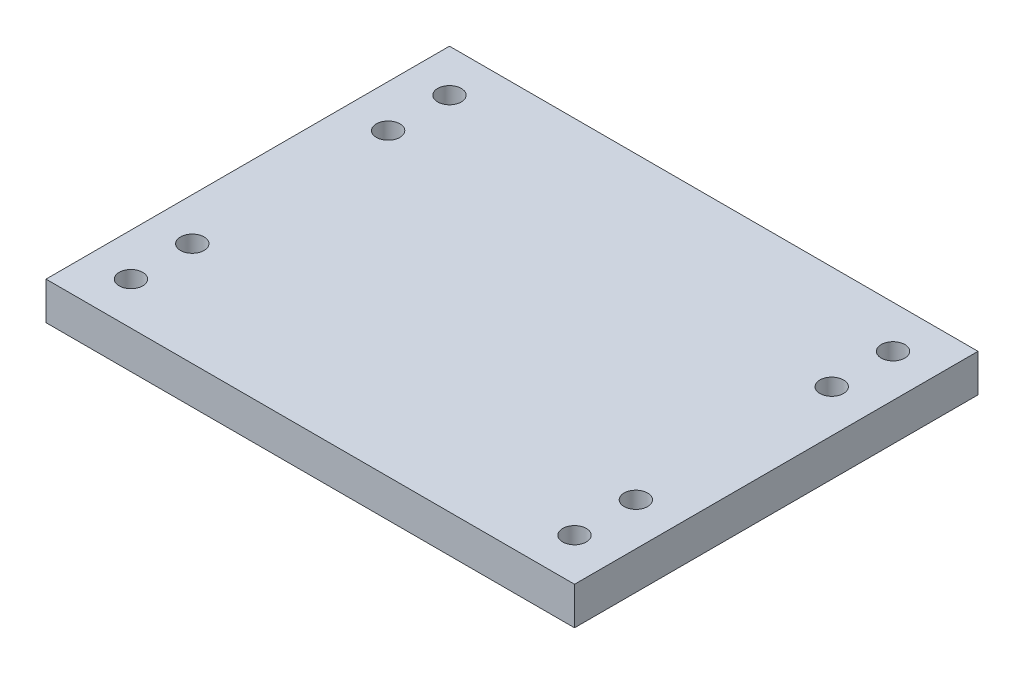
ISO-10303-21;
HEADER;
FILE_DESCRIPTION(('STEP AP214'),'2;1');
FILE_NAME('part.step','',(''),(''),'','','');
FILE_SCHEMA(('AUTOMOTIVE_DESIGN { 1 0 10303 214 1 1 1 1 }'));
ENDSEC;
DATA;
#1=APPLICATION_CONTEXT('core data for automotive mechanical design processes');
#2=APPLICATION_PROTOCOL_DEFINITION('international standard','automotive_design',2000,#1);
#3=PRODUCT_CONTEXT('',#1,'mechanical');
#4=PRODUCT('Part','Part','',(#3));
#5=PRODUCT_RELATED_PRODUCT_CATEGORY('part','',(#4));
#6=PRODUCT_DEFINITION_FORMATION('','',#4);
#7=PRODUCT_DEFINITION_CONTEXT('part definition',#1,'design');
#8=PRODUCT_DEFINITION('design','',#6,#7);
#9=PRODUCT_DEFINITION_SHAPE('','',#8);
#10=(LENGTH_UNIT() NAMED_UNIT(*) SI_UNIT(.MILLI.,.METRE.));
#11=(NAMED_UNIT(*) PLANE_ANGLE_UNIT() SI_UNIT($,.RADIAN.));
#12=(NAMED_UNIT(*) SI_UNIT($,.STERADIAN.) SOLID_ANGLE_UNIT());
#13=UNCERTAINTY_MEASURE_WITH_UNIT(LENGTH_MEASURE(1.E-05),#10,'distance_accuracy_value','');
#14=(GEOMETRIC_REPRESENTATION_CONTEXT(3) GLOBAL_UNCERTAINTY_ASSIGNED_CONTEXT((#13)) GLOBAL_UNIT_ASSIGNED_CONTEXT((#10,
#11,#12)) REPRESENTATION_CONTEXT('',''));
#15=CARTESIAN_POINT('',(0.,0.,0.));
#16=DIRECTION('',(0.,0.,1.));
#17=DIRECTION('',(1.,0.,0.));
#18=AXIS2_PLACEMENT_3D('',#15,#16,#17);
#19=CARTESIAN_POINT('',(11.2,1.6,-8.55));
#20=DIRECTION('',(-1.,0.,0.));
#21=DIRECTION('',(0.,0.,1.));
#22=AXIS2_PLACEMENT_3D('',#19,#20,#21);
#23=PLANE('',#22);
#24=DIRECTION('',(0.,0.,-1.));
#25=VECTOR('',#24,1.);
#26=CARTESIAN_POINT('',(11.2,0.,-8.55));
#27=LINE('',#26,#25);
#28=CARTESIAN_POINT('',(11.2,0.,8.55));
#29=VERTEX_POINT('',#28);
#30=CARTESIAN_POINT('',(11.2,0.,-8.55));
#31=VERTEX_POINT('',#30);
#32=EDGE_CURVE('E95',#29,#31,#27,.T.);
#33=ORIENTED_EDGE('',*,*,#32,.T.);
#34=DIRECTION('',(0.,-1.,0.));
#35=VECTOR('',#34,1.);
#36=CARTESIAN_POINT('',(11.2,1.6,-8.55));
#37=LINE('',#36,#35);
#38=CARTESIAN_POINT('',(11.2,1.6,-8.55));
#39=VERTEX_POINT('',#38);
#40=EDGE_CURVE('E11',#39,#31,#37,.T.);
#41=ORIENTED_EDGE('',*,*,#40,.F.);
#42=DIRECTION('',(0.,0.,-1.));
#43=VECTOR('',#42,1.);
#44=CARTESIAN_POINT('',(11.2,1.6,-8.55));
#45=LINE('',#44,#43);
#46=CARTESIAN_POINT('',(11.2,1.6,8.55));
#47=VERTEX_POINT('',#46);
#48=EDGE_CURVE('E83',#47,#39,#45,.T.);
#49=ORIENTED_EDGE('',*,*,#48,.F.);
#50=DIRECTION('',(0.,-1.,0.));
#51=VECTOR('',#50,1.);
#52=CARTESIAN_POINT('',(11.2,1.6,8.55));
#53=LINE('',#52,#51);
#54=EDGE_CURVE('E91',#47,#29,#53,.T.);
#55=ORIENTED_EDGE('',*,*,#54,.T.);
#56=EDGE_LOOP('',(#33,#41,#49,#55));
#57=FACE_BOUND('',#56,.T.);
#58=ADVANCED_FACE('F32',(#57),#23,.F.);
#59=CARTESIAN_POINT('',(-11.2,1.6,-8.55));
#60=DIRECTION('',(0.,0.,1.));
#61=DIRECTION('',(1.,0.,0.));
#62=AXIS2_PLACEMENT_3D('',#59,#60,#61);
#63=PLANE('',#62);
#64=DIRECTION('',(-1.,0.,0.));
#65=VECTOR('',#64,1.);
#66=CARTESIAN_POINT('',(-11.2,0.,-8.55));
#67=LINE('',#66,#65);
#68=CARTESIAN_POINT('',(-11.2,0.,-8.55));
#69=VERTEX_POINT('',#68);
#70=EDGE_CURVE('E87',#31,#69,#67,.T.);
#71=ORIENTED_EDGE('',*,*,#70,.T.);
#72=DIRECTION('',(0.,-1.,0.));
#73=VECTOR('',#72,1.);
#74=CARTESIAN_POINT('',(-11.2,1.6,-8.55));
#75=LINE('',#74,#73);
#76=CARTESIAN_POINT('',(-11.2,1.6,-8.55));
#77=VERTEX_POINT('',#76);
#78=EDGE_CURVE('E40',#77,#69,#75,.T.);
#79=ORIENTED_EDGE('',*,*,#78,.F.);
#80=DIRECTION('',(-1.,0.,0.));
#81=VECTOR('',#80,1.);
#82=CARTESIAN_POINT('',(-11.2,1.6,-8.55));
#83=LINE('',#82,#81);
#84=EDGE_CURVE('E78',#39,#77,#83,.T.);
#85=ORIENTED_EDGE('',*,*,#84,.F.);
#86=ORIENTED_EDGE('',*,*,#40,.T.);
#87=EDGE_LOOP('',(#71,#79,#85,#86));
#88=FACE_BOUND('',#87,.T.);
#89=ADVANCED_FACE('F86',(#88),#63,.F.);
#90=CARTESIAN_POINT('',(-11.2,1.6,-8.55));
#91=DIRECTION('',(1.,0.,0.));
#92=DIRECTION('',(0.,0.,-1.));
#93=AXIS2_PLACEMENT_3D('',#90,#91,#92);
#94=PLANE('',#93);
#95=DIRECTION('',(0.,0.,1.));
#96=VECTOR('',#95,1.);
#97=CARTESIAN_POINT('',(-11.2,0.,-8.55));
#98=LINE('',#97,#96);
#99=CARTESIAN_POINT('',(-11.2,0.,8.55));
#100=VERTEX_POINT('',#99);
#101=EDGE_CURVE('E65',#69,#100,#98,.T.);
#102=ORIENTED_EDGE('',*,*,#101,.T.);
#103=DIRECTION('',(0.,-1.,0.));
#104=VECTOR('',#103,1.);
#105=CARTESIAN_POINT('',(-11.2,1.6,8.55));
#106=LINE('',#105,#104);
#107=CARTESIAN_POINT('',(-11.2,1.6,8.55));
#108=VERTEX_POINT('',#107);
#109=EDGE_CURVE('E88',#108,#100,#106,.T.);
#110=ORIENTED_EDGE('',*,*,#109,.F.);
#111=DIRECTION('',(0.,0.,1.));
#112=VECTOR('',#111,1.);
#113=CARTESIAN_POINT('',(-11.2,1.6,-8.55));
#114=LINE('',#113,#112);
#115=EDGE_CURVE('E81',#77,#108,#114,.T.);
#116=ORIENTED_EDGE('',*,*,#115,.F.);
#117=ORIENTED_EDGE('',*,*,#78,.T.);
#118=EDGE_LOOP('',(#102,#110,#116,#117));
#119=FACE_BOUND('',#118,.T.);
#120=ADVANCED_FACE('F89',(#119),#94,.F.);
#121=CARTESIAN_POINT('',(-11.2,1.6,8.55));
#122=DIRECTION('',(0.,0.,-1.));
#123=DIRECTION('',(-1.,0.,0.));
#124=AXIS2_PLACEMENT_3D('',#121,#122,#123);
#125=PLANE('',#124);
#126=DIRECTION('',(1.,0.,0.));
#127=VECTOR('',#126,1.);
#128=CARTESIAN_POINT('',(-11.2,0.,8.55));
#129=LINE('',#128,#127);
#130=EDGE_CURVE('E71',#100,#29,#129,.T.);
#131=ORIENTED_EDGE('',*,*,#130,.T.);
#132=ORIENTED_EDGE('',*,*,#54,.F.);
#133=DIRECTION('',(1.,0.,0.));
#134=VECTOR('',#133,1.);
#135=CARTESIAN_POINT('',(-11.2,1.6,8.55));
#136=LINE('',#135,#134);
#137=EDGE_CURVE('E48',#108,#47,#136,.T.);
#138=ORIENTED_EDGE('',*,*,#137,.F.);
#139=ORIENTED_EDGE('',*,*,#109,.T.);
#140=EDGE_LOOP('',(#131,#132,#138,#139));
#141=FACE_BOUND('',#140,.T.);
#142=ADVANCED_FACE('F103',(#141),#125,.F.);
#143=CARTESIAN_POINT('',(0.,1.6,0.));
#144=DIRECTION('',(0.,1.,0.));
#145=DIRECTION('',(0.,0.,1.));
#146=AXIS2_PLACEMENT_3D('',#143,#144,#145);
#147=PLANE('',#146);
#148=CARTESIAN_POINT('',(9.4,1.6,6.75));
#149=DIRECTION('',(0.,1.,0.));
#150=DIRECTION('',(0.,0.,-1.));
#151=AXIS2_PLACEMENT_3D('',#148,#149,#150);
#152=CIRCLE('',#151,0.500000000000001);
#153=CARTESIAN_POINT('',(9.4,1.6,6.25));
#154=VERTEX_POINT('',#153);
#155=EDGE_CURVE('E151',#154,#154,#152,.T.);
#156=ORIENTED_EDGE('',*,*,#155,.F.);
#157=EDGE_LOOP('',(#156));
#158=FACE_BOUND('',#157,.T.);
#159=CARTESIAN_POINT('',(9.4,1.6,4.15));
#160=DIRECTION('',(0.,1.,0.));
#161=DIRECTION('',(0.,0.,-1.));
#162=AXIS2_PLACEMENT_3D('',#159,#160,#161);
#163=CIRCLE('',#162,0.500000000000001);
#164=CARTESIAN_POINT('',(9.4,1.6,3.65));
#165=VERTEX_POINT('',#164);
#166=EDGE_CURVE('E145',#165,#165,#163,.T.);
#167=ORIENTED_EDGE('',*,*,#166,.F.);
#168=EDGE_LOOP('',(#167));
#169=FACE_BOUND('',#168,.T.);
#170=CARTESIAN_POINT('',(-9.4,1.6,6.75));
#171=DIRECTION('',(0.,-1.,0.));
#172=DIRECTION('',(0.,0.,-1.));
#173=AXIS2_PLACEMENT_3D('',#170,#171,#172);
#174=CIRCLE('',#173,0.500000000000001);
#175=CARTESIAN_POINT('',(-9.4,1.6,6.25));
#176=VERTEX_POINT('',#175);
#177=EDGE_CURVE('E140',#176,#176,#174,.T.);
#178=ORIENTED_EDGE('',*,*,#177,.T.);
#179=EDGE_LOOP('',(#178));
#180=FACE_BOUND('',#179,.T.);
#181=CARTESIAN_POINT('',(-9.4,1.6,4.15));
#182=DIRECTION('',(0.,-1.,0.));
#183=DIRECTION('',(0.,0.,-1.));
#184=AXIS2_PLACEMENT_3D('',#181,#182,#183);
#185=CIRCLE('',#184,0.500000000000001);
#186=CARTESIAN_POINT('',(-9.4,1.6,3.65));
#187=VERTEX_POINT('',#186);
#188=EDGE_CURVE('E133',#187,#187,#185,.T.);
#189=ORIENTED_EDGE('',*,*,#188,.T.);
#190=EDGE_LOOP('',(#189));
#191=FACE_BOUND('',#190,.T.);
#192=CARTESIAN_POINT('',(9.4,1.6,-6.75));
#193=DIRECTION('',(0.,-1.,0.));
#194=DIRECTION('',(0.,0.,1.));
#195=AXIS2_PLACEMENT_3D('',#192,#193,#194);
#196=CIRCLE('',#195,0.500000000000001);
#197=CARTESIAN_POINT('',(9.4,1.6,-6.25));
#198=VERTEX_POINT('',#197);
#199=EDGE_CURVE('E128',#198,#198,#196,.T.);
#200=ORIENTED_EDGE('',*,*,#199,.T.);
#201=EDGE_LOOP('',(#200));
#202=FACE_BOUND('',#201,.T.);
#203=CARTESIAN_POINT('',(9.4,1.6,-4.15));
#204=DIRECTION('',(0.,-1.,0.));
#205=DIRECTION('',(0.,0.,1.));
#206=AXIS2_PLACEMENT_3D('',#203,#204,#205);
#207=CIRCLE('',#206,0.500000000000001);
#208=CARTESIAN_POINT('',(9.4,1.6,-3.65));
#209=VERTEX_POINT('',#208);
#210=EDGE_CURVE('E121',#209,#209,#207,.T.);
#211=ORIENTED_EDGE('',*,*,#210,.T.);
#212=EDGE_LOOP('',(#211));
#213=FACE_BOUND('',#212,.T.);
#214=CARTESIAN_POINT('',(-9.4,1.6,-6.75));
#215=DIRECTION('',(0.,1.,0.));
#216=DIRECTION('',(0.,0.,1.));
#217=AXIS2_PLACEMENT_3D('',#214,#215,#216);
#218=CIRCLE('',#217,0.500000000000001);
#219=CARTESIAN_POINT('',(-9.4,1.6,-6.25));
#220=VERTEX_POINT('',#219);
#221=EDGE_CURVE('E116',#220,#220,#218,.T.);
#222=ORIENTED_EDGE('',*,*,#221,.F.);
#223=EDGE_LOOP('',(#222));
#224=FACE_BOUND('',#223,.T.);
#225=CARTESIAN_POINT('',(-9.4,1.6,-4.15));
#226=DIRECTION('',(0.,1.,0.));
#227=DIRECTION('',(0.,0.,1.));
#228=AXIS2_PLACEMENT_3D('',#225,#226,#227);
#229=CIRCLE('',#228,0.500000000000001);
#230=CARTESIAN_POINT('',(-9.4,1.6,-3.65));
#231=VERTEX_POINT('',#230);
#232=EDGE_CURVE('E109',#231,#231,#229,.T.);
#233=ORIENTED_EDGE('',*,*,#232,.F.);
#234=EDGE_LOOP('',(#233));
#235=FACE_BOUND('',#234,.T.);
#236=ORIENTED_EDGE('',*,*,#48,.T.);
#237=ORIENTED_EDGE('',*,*,#84,.T.);
#238=ORIENTED_EDGE('',*,*,#115,.T.);
#239=ORIENTED_EDGE('',*,*,#137,.T.);
#240=EDGE_LOOP('',(#236,#237,#238,#239));
#241=FACE_BOUND('',#240,.T.);
#242=ADVANCED_FACE('F79',(#158,#169,#180,#191,#202,#213,#224,#235,#241),#147,.T.);
#243=CARTESIAN_POINT('',(0.,0.,0.));
#244=DIRECTION('',(0.,1.,0.));
#245=DIRECTION('',(0.,0.,1.));
#246=AXIS2_PLACEMENT_3D('',#243,#244,#245);
#247=PLANE('',#246);
#248=CARTESIAN_POINT('',(9.4,0.,6.75));
#249=DIRECTION('',(0.,1.,0.));
#250=DIRECTION('',(0.,0.,-1.));
#251=AXIS2_PLACEMENT_3D('',#248,#249,#250);
#252=CIRCLE('',#251,0.500000000000001);
#253=CARTESIAN_POINT('',(9.4,0.,6.25));
#254=VERTEX_POINT('',#253);
#255=EDGE_CURVE('E137',#254,#254,#252,.T.);
#256=ORIENTED_EDGE('',*,*,#255,.T.);
#257=EDGE_LOOP('',(#256));
#258=FACE_BOUND('',#257,.T.);
#259=CARTESIAN_POINT('',(9.4,0.,4.15));
#260=DIRECTION('',(0.,1.,0.));
#261=DIRECTION('',(0.,0.,-1.));
#262=AXIS2_PLACEMENT_3D('',#259,#260,#261);
#263=CIRCLE('',#262,0.500000000000001);
#264=CARTESIAN_POINT('',(9.4,0.,3.65));
#265=VERTEX_POINT('',#264);
#266=EDGE_CURVE('E148',#265,#265,#263,.T.);
#267=ORIENTED_EDGE('',*,*,#266,.T.);
#268=EDGE_LOOP('',(#267));
#269=FACE_BOUND('',#268,.T.);
#270=CARTESIAN_POINT('',(-9.4,0.,6.75));
#271=DIRECTION('',(0.,-1.,0.));
#272=DIRECTION('',(0.,0.,-1.));
#273=AXIS2_PLACEMENT_3D('',#270,#271,#272);
#274=CIRCLE('',#273,0.500000000000001);
#275=CARTESIAN_POINT('',(-9.4,0.,6.25));
#276=VERTEX_POINT('',#275);
#277=EDGE_CURVE('E125',#276,#276,#274,.T.);
#278=ORIENTED_EDGE('',*,*,#277,.F.);
#279=EDGE_LOOP('',(#278));
#280=FACE_BOUND('',#279,.T.);
#281=CARTESIAN_POINT('',(-9.4,0.,4.15));
#282=DIRECTION('',(0.,-1.,0.));
#283=DIRECTION('',(0.,0.,-1.));
#284=AXIS2_PLACEMENT_3D('',#281,#282,#283);
#285=CIRCLE('',#284,0.500000000000001);
#286=CARTESIAN_POINT('',(-9.4,0.,3.65));
#287=VERTEX_POINT('',#286);
#288=EDGE_CURVE('E136',#287,#287,#285,.T.);
#289=ORIENTED_EDGE('',*,*,#288,.F.);
#290=EDGE_LOOP('',(#289));
#291=FACE_BOUND('',#290,.T.);
#292=CARTESIAN_POINT('',(9.4,0.,-6.75));
#293=DIRECTION('',(0.,-1.,0.));
#294=DIRECTION('',(0.,0.,1.));
#295=AXIS2_PLACEMENT_3D('',#292,#293,#294);
#296=CIRCLE('',#295,0.500000000000001);
#297=CARTESIAN_POINT('',(9.4,0.,-6.25));
#298=VERTEX_POINT('',#297);
#299=EDGE_CURVE('E113',#298,#298,#296,.T.);
#300=ORIENTED_EDGE('',*,*,#299,.F.);
#301=EDGE_LOOP('',(#300));
#302=FACE_BOUND('',#301,.T.);
#303=CARTESIAN_POINT('',(9.4,0.,-4.15));
#304=DIRECTION('',(0.,-1.,0.));
#305=DIRECTION('',(0.,0.,1.));
#306=AXIS2_PLACEMENT_3D('',#303,#304,#305);
#307=CIRCLE('',#306,0.500000000000001);
#308=CARTESIAN_POINT('',(9.4,0.,-3.65));
#309=VERTEX_POINT('',#308);
#310=EDGE_CURVE('E124',#309,#309,#307,.T.);
#311=ORIENTED_EDGE('',*,*,#310,.F.);
#312=EDGE_LOOP('',(#311));
#313=FACE_BOUND('',#312,.T.);
#314=CARTESIAN_POINT('',(-9.4,0.,-6.75));
#315=DIRECTION('',(0.,1.,0.));
#316=DIRECTION('',(0.,0.,1.));
#317=AXIS2_PLACEMENT_3D('',#314,#315,#316);
#318=CIRCLE('',#317,0.500000000000001);
#319=CARTESIAN_POINT('',(-9.4,0.,-6.25));
#320=VERTEX_POINT('',#319);
#321=EDGE_CURVE('E98',#320,#320,#318,.T.);
#322=ORIENTED_EDGE('',*,*,#321,.T.);
#323=EDGE_LOOP('',(#322));
#324=FACE_BOUND('',#323,.T.);
#325=CARTESIAN_POINT('',(-9.4,0.,-4.15));
#326=DIRECTION('',(0.,1.,0.));
#327=DIRECTION('',(0.,0.,1.));
#328=AXIS2_PLACEMENT_3D('',#325,#326,#327);
#329=CIRCLE('',#328,0.500000000000001);
#330=CARTESIAN_POINT('',(-9.4,0.,-3.65));
#331=VERTEX_POINT('',#330);
#332=EDGE_CURVE('E112',#331,#331,#329,.T.);
#333=ORIENTED_EDGE('',*,*,#332,.T.);
#334=EDGE_LOOP('',(#333));
#335=FACE_BOUND('',#334,.T.);
#336=ORIENTED_EDGE('',*,*,#32,.F.);
#337=ORIENTED_EDGE('',*,*,#130,.F.);
#338=ORIENTED_EDGE('',*,*,#101,.F.);
#339=ORIENTED_EDGE('',*,*,#70,.F.);
#340=EDGE_LOOP('',(#336,#337,#338,#339));
#341=FACE_BOUND('',#340,.T.);
#342=ADVANCED_FACE('F106',(#258,#269,#280,#291,#302,#313,#324,#335,#341),#247,.F.);
#343=CARTESIAN_POINT('',(-9.4,0.,-4.15));
#344=DIRECTION('',(0.,1.,0.));
#345=DIRECTION('',(0.,0.,1.));
#346=AXIS2_PLACEMENT_3D('',#343,#344,#345);
#347=CYLINDRICAL_SURFACE('',#346,0.500000000000001);
#348=ORIENTED_EDGE('',*,*,#332,.F.);
#349=EDGE_LOOP('',(#348));
#350=FACE_BOUND('',#349,.T.);
#351=ORIENTED_EDGE('',*,*,#232,.T.);
#352=EDGE_LOOP('',(#351));
#353=FACE_BOUND('',#352,.T.);
#354=ADVANCED_FACE('F183',(#350,#353),#347,.F.);
#355=CARTESIAN_POINT('',(-9.4,0.,-6.75));
#356=DIRECTION('',(0.,1.,0.));
#357=DIRECTION('',(0.,0.,1.));
#358=AXIS2_PLACEMENT_3D('',#355,#356,#357);
#359=CYLINDRICAL_SURFACE('',#358,0.500000000000001);
#360=ORIENTED_EDGE('',*,*,#321,.F.);
#361=EDGE_LOOP('',(#360));
#362=FACE_BOUND('',#361,.T.);
#363=ORIENTED_EDGE('',*,*,#221,.T.);
#364=EDGE_LOOP('',(#363));
#365=FACE_BOUND('',#364,.T.);
#366=ADVANCED_FACE('F185',(#362,#365),#359,.F.);
#367=CARTESIAN_POINT('',(9.4,0.,-4.15));
#368=DIRECTION('',(0.,1.,0.));
#369=DIRECTION('',(0.,0.,1.));
#370=AXIS2_PLACEMENT_3D('',#367,#368,#369);
#371=CYLINDRICAL_SURFACE('',#370,0.500000000000001);
#372=ORIENTED_EDGE('',*,*,#310,.T.);
#373=EDGE_LOOP('',(#372));
#374=FACE_BOUND('',#373,.T.);
#375=ORIENTED_EDGE('',*,*,#210,.F.);
#376=EDGE_LOOP('',(#375));
#377=FACE_BOUND('',#376,.T.);
#378=ADVANCED_FACE('F192',(#374,#377),#371,.F.);
#379=CARTESIAN_POINT('',(9.4,0.,-6.75));
#380=DIRECTION('',(0.,1.,0.));
#381=DIRECTION('',(0.,0.,1.));
#382=AXIS2_PLACEMENT_3D('',#379,#380,#381);
#383=CYLINDRICAL_SURFACE('',#382,0.500000000000001);
#384=ORIENTED_EDGE('',*,*,#299,.T.);
#385=EDGE_LOOP('',(#384));
#386=FACE_BOUND('',#385,.T.);
#387=ORIENTED_EDGE('',*,*,#199,.F.);
#388=EDGE_LOOP('',(#387));
#389=FACE_BOUND('',#388,.T.);
#390=ADVANCED_FACE('F232',(#386,#389),#383,.F.);
#391=CARTESIAN_POINT('',(-9.4,0.,4.15));
#392=DIRECTION('',(0.,1.,0.));
#393=DIRECTION('',(0.,0.,1.));
#394=AXIS2_PLACEMENT_3D('',#391,#392,#393);
#395=CYLINDRICAL_SURFACE('',#394,0.500000000000001);
#396=ORIENTED_EDGE('',*,*,#288,.T.);
#397=EDGE_LOOP('',(#396));
#398=FACE_BOUND('',#397,.T.);
#399=ORIENTED_EDGE('',*,*,#188,.F.);
#400=EDGE_LOOP('',(#399));
#401=FACE_BOUND('',#400,.T.);
#402=ADVANCED_FACE('F226',(#398,#401),#395,.F.);
#403=CARTESIAN_POINT('',(-9.4,0.,6.75));
#404=DIRECTION('',(0.,1.,0.));
#405=DIRECTION('',(0.,0.,1.));
#406=AXIS2_PLACEMENT_3D('',#403,#404,#405);
#407=CYLINDRICAL_SURFACE('',#406,0.500000000000001);
#408=ORIENTED_EDGE('',*,*,#277,.T.);
#409=EDGE_LOOP('',(#408));
#410=FACE_BOUND('',#409,.T.);
#411=ORIENTED_EDGE('',*,*,#177,.F.);
#412=EDGE_LOOP('',(#411));
#413=FACE_BOUND('',#412,.T.);
#414=ADVANCED_FACE('F231',(#410,#413),#407,.F.);
#415=CARTESIAN_POINT('',(9.4,0.,4.15));
#416=DIRECTION('',(0.,1.,0.));
#417=DIRECTION('',(0.,0.,1.));
#418=AXIS2_PLACEMENT_3D('',#415,#416,#417);
#419=CYLINDRICAL_SURFACE('',#418,0.500000000000001);
#420=ORIENTED_EDGE('',*,*,#266,.F.);
#421=EDGE_LOOP('',(#420));
#422=FACE_BOUND('',#421,.T.);
#423=ORIENTED_EDGE('',*,*,#166,.T.);
#424=EDGE_LOOP('',(#423));
#425=FACE_BOUND('',#424,.T.);
#426=ADVANCED_FACE('F162',(#422,#425),#419,.F.);
#427=CARTESIAN_POINT('',(9.4,0.,6.75));
#428=DIRECTION('',(0.,1.,0.));
#429=DIRECTION('',(0.,0.,1.));
#430=AXIS2_PLACEMENT_3D('',#427,#428,#429);
#431=CYLINDRICAL_SURFACE('',#430,0.500000000000001);
#432=ORIENTED_EDGE('',*,*,#255,.F.);
#433=EDGE_LOOP('',(#432));
#434=FACE_BOUND('',#433,.T.);
#435=ORIENTED_EDGE('',*,*,#155,.T.);
#436=EDGE_LOOP('',(#435));
#437=FACE_BOUND('',#436,.T.);
#438=ADVANCED_FACE('F159',(#434,#437),#431,.F.);
#439=CLOSED_SHELL('',(#58,#89,#120,#142,#242,#342,#354,#366,#378,#390,#402,#414,#426,#438));
#440=MANIFOLD_SOLID_BREP('B2',#439);
#441=ADVANCED_BREP_SHAPE_REPRESENTATION('',(#18,#440),#14);
#442=SHAPE_DEFINITION_REPRESENTATION(#9,#441);
ENDSEC;
END-ISO-10303-21;
